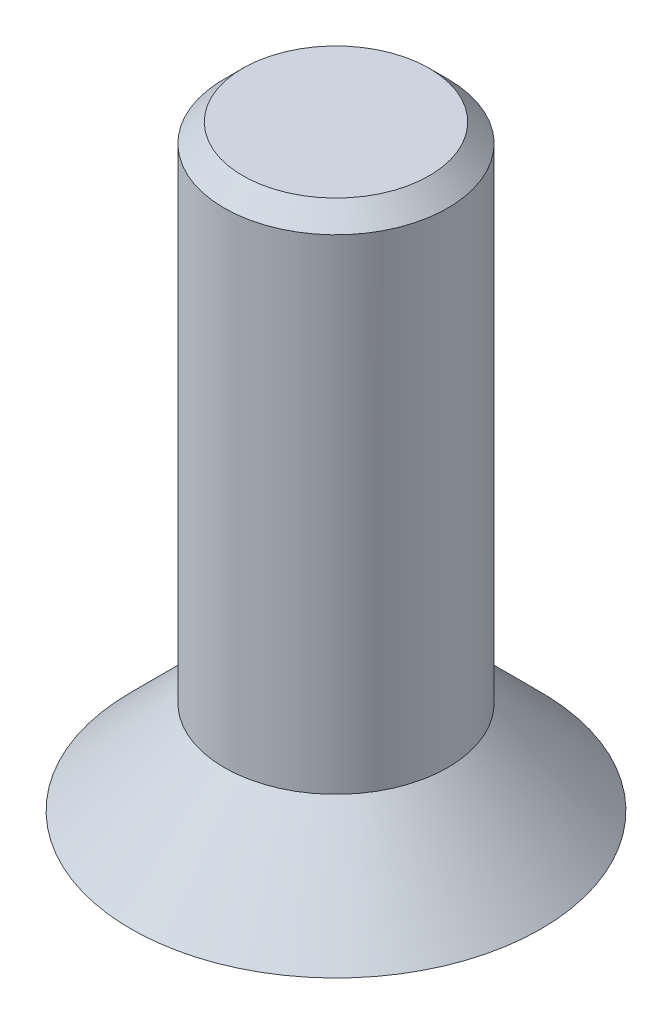
ISO-10303-21;
HEADER;
FILE_DESCRIPTION(('STEP AP214'),'2;1');
FILE_NAME('part.step','',(''),(''),'','','');
FILE_SCHEMA(('AUTOMOTIVE_DESIGN { 1 0 10303 214 1 1 1 1 }'));
ENDSEC;
DATA;
#1=APPLICATION_CONTEXT('core data for automotive mechanical design processes');
#2=APPLICATION_PROTOCOL_DEFINITION('international standard','automotive_design',2000,#1);
#3=PRODUCT_CONTEXT('',#1,'mechanical');
#4=PRODUCT('Part','Part','',(#3));
#5=PRODUCT_RELATED_PRODUCT_CATEGORY('part','',(#4));
#6=PRODUCT_DEFINITION_FORMATION('','',#4);
#7=PRODUCT_DEFINITION_CONTEXT('part definition',#1,'design');
#8=PRODUCT_DEFINITION('design','',#6,#7);
#9=PRODUCT_DEFINITION_SHAPE('','',#8);
#10=(LENGTH_UNIT() NAMED_UNIT(*) SI_UNIT(.MILLI.,.METRE.));
#11=(NAMED_UNIT(*) PLANE_ANGLE_UNIT() SI_UNIT($,.RADIAN.));
#12=(NAMED_UNIT(*) SI_UNIT($,.STERADIAN.) SOLID_ANGLE_UNIT());
#13=UNCERTAINTY_MEASURE_WITH_UNIT(LENGTH_MEASURE(1.E-05),#10,'distance_accuracy_value','');
#14=(GEOMETRIC_REPRESENTATION_CONTEXT(3) GLOBAL_UNCERTAINTY_ASSIGNED_CONTEXT((#13)) GLOBAL_UNIT_ASSIGNED_CONTEXT((#10,
#11,#12)) REPRESENTATION_CONTEXT('',''));
#15=CARTESIAN_POINT('',(0.,0.,0.));
#16=DIRECTION('',(0.,0.,1.));
#17=DIRECTION('',(1.,0.,0.));
#18=AXIS2_PLACEMENT_3D('',#15,#16,#17);
#19=CARTESIAN_POINT('',(-7.25,6.5,0.));
#20=DIRECTION('',(0.,-1.,0.));
#21=DIRECTION('',(0.,0.,-1.));
#22=AXIS2_PLACEMENT_3D('',#19,#20,#21);
#23=PLANE('',#22);
#24=CARTESIAN_POINT('',(-10.,6.50000000001683,0.));
#25=DIRECTION('',(0.,-1.,0.));
#26=DIRECTION('',(1.,0.,0.));
#27=AXIS2_PLACEMENT_3D('',#24,#25,#26);
#28=CIRCLE('',#27,5.49999999998363);
#29=CARTESIAN_POINT('',(-4.50000000001637,6.50000000001683,0.));
#30=VERTEX_POINT('',#29);
#31=EDGE_CURVE('E16',#30,#30,#28,.F.);
#32=ORIENTED_EDGE('',*,*,#31,.F.);
#33=EDGE_LOOP('',(#32));
#34=FACE_BOUND('',#33,.T.);
#35=ADVANCED_FACE('F13',(#34),#23,.T.);
#36=CARTESIAN_POINT('',(-8.5,22.5,0.));
#37=DIRECTION('',(0.,1.,0.));
#38=DIRECTION('',(0.,0.,1.));
#39=AXIS2_PLACEMENT_3D('',#36,#37,#38);
#40=PLANE('',#39);
#41=CARTESIAN_POINT('',(-10.,22.5000000000364,0.));
#42=DIRECTION('',(0.,-1.,0.));
#43=DIRECTION('',(0.,0.,-1.));
#44=AXIS2_PLACEMENT_3D('',#41,#42,#43);
#45=CIRCLE('',#44,2.49999999999773);
#46=CARTESIAN_POINT('',(-10.,22.5000000000364,-2.49999999999773));
#47=VERTEX_POINT('',#46);
#48=EDGE_CURVE('E25',#47,#47,#45,.T.);
#49=ORIENTED_EDGE('',*,*,#48,.F.);
#50=EDGE_LOOP('',(#49));
#51=FACE_BOUND('',#50,.T.);
#52=ADVANCED_FACE('F37',(#51),#40,.T.);
#53=CARTESIAN_POINT('',(-10.,6.50000000001683,0.));
#54=DIRECTION('',(0.,-1.,0.));
#55=DIRECTION('',(1.,0.,0.));
#56=AXIS2_PLACEMENT_3D('',#53,#54,#55);
#57=CONICAL_SURFACE('',#56,5.49999999998363,0.785398163374711);
#58=ORIENTED_EDGE('',*,*,#31,.T.);
#59=EDGE_LOOP('',(#58));
#60=FACE_BOUND('',#59,.T.);
#61=CARTESIAN_POINT('',(-10.,9.,0.));
#62=DIRECTION('',(0.,1.,0.));
#63=DIRECTION('',(0.,0.,1.));
#64=AXIS2_PLACEMENT_3D('',#61,#62,#63);
#65=CIRCLE('',#64,3.);
#66=CARTESIAN_POINT('',(-10.,9.,3.));
#67=VERTEX_POINT('',#66);
#68=EDGE_CURVE('E20',#67,#67,#65,.T.);
#69=ORIENTED_EDGE('',*,*,#68,.F.);
#70=EDGE_LOOP('',(#69));
#71=FACE_BOUND('',#70,.T.);
#72=ADVANCED_FACE('F33',(#60,#71),#57,.T.);
#73=CARTESIAN_POINT('',(-10.,22.000000000105,0.));
#74=DIRECTION('',(0.,-1.,0.));
#75=DIRECTION('',(0.,0.,-1.));
#76=AXIS2_PLACEMENT_3D('',#73,#74,#75);
#77=CONICAL_SURFACE('',#76,2.9999999999859,0.785398163454292);
#78=CARTESIAN_POINT('',(-10.,22.,0.));
#79=DIRECTION('',(0.,1.,0.));
#80=DIRECTION('',(0.,0.,1.));
#81=AXIS2_PLACEMENT_3D('',#78,#79,#80);
#82=CIRCLE('',#81,3.);
#83=CARTESIAN_POINT('',(-10.,22.,3.));
#84=VERTEX_POINT('',#83);
#85=EDGE_CURVE('E9',#84,#84,#82,.F.);
#86=ORIENTED_EDGE('',*,*,#85,.F.);
#87=EDGE_LOOP('',(#86));
#88=FACE_BOUND('',#87,.T.);
#89=ORIENTED_EDGE('',*,*,#48,.T.);
#90=EDGE_LOOP('',(#89));
#91=FACE_BOUND('',#90,.T.);
#92=ADVANCED_FACE('F45',(#88,#91),#77,.T.);
#93=CARTESIAN_POINT('',(-10.,15.75,0.));
#94=DIRECTION('',(0.,1.,0.));
#95=DIRECTION('',(0.,0.,1.));
#96=AXIS2_PLACEMENT_3D('',#93,#94,#95);
#97=CYLINDRICAL_SURFACE('',#96,3.);
#98=ORIENTED_EDGE('',*,*,#85,.T.);
#99=EDGE_LOOP('',(#98));
#100=FACE_BOUND('',#99,.T.);
#101=ORIENTED_EDGE('',*,*,#68,.T.);
#102=EDGE_LOOP('',(#101));
#103=FACE_BOUND('',#102,.T.);
#104=ADVANCED_FACE('F43',(#100,#103),#97,.T.);
#105=CLOSED_SHELL('',(#35,#52,#72,#92,#104));
#106=MANIFOLD_SOLID_BREP('B1',#105);
#107=ADVANCED_BREP_SHAPE_REPRESENTATION('',(#18,#106),#14);
#108=SHAPE_DEFINITION_REPRESENTATION(#9,#107);
ENDSEC;
END-ISO-10303-21;
